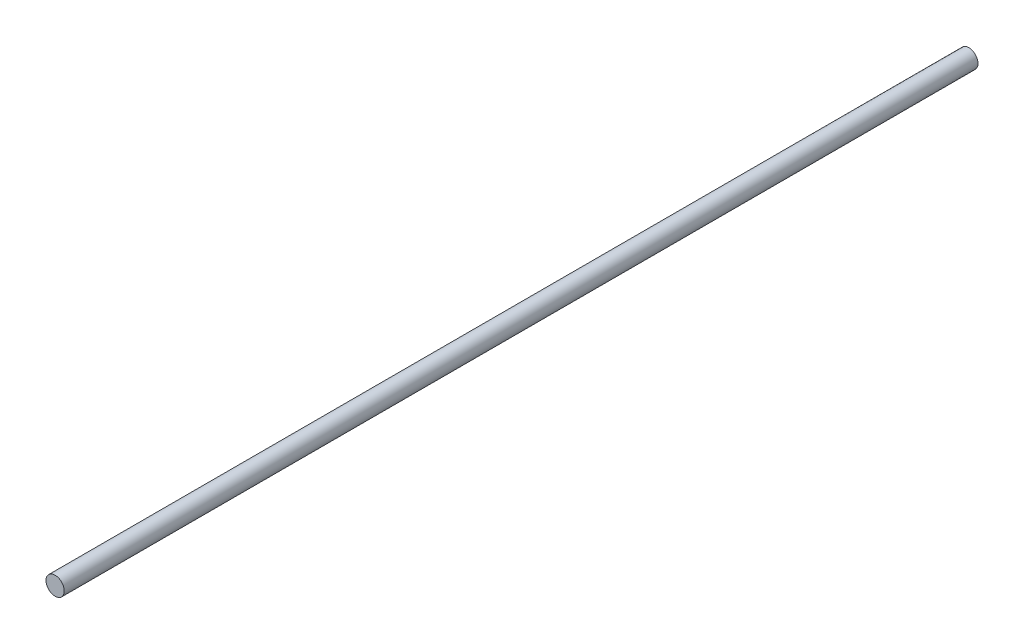
ISO-10303-21;
HEADER;
FILE_DESCRIPTION(('STEP AP214'),'2;1');
FILE_NAME('part.step','',(''),(''),'','','');
FILE_SCHEMA(('AUTOMOTIVE_DESIGN { 1 0 10303 214 1 1 1 1 }'));
ENDSEC;
DATA;
#1=APPLICATION_CONTEXT('core data for automotive mechanical design processes');
#2=APPLICATION_PROTOCOL_DEFINITION('international standard','automotive_design',2000,#1);
#3=PRODUCT_CONTEXT('',#1,'mechanical');
#4=PRODUCT('Part','Part','',(#3));
#5=PRODUCT_RELATED_PRODUCT_CATEGORY('part','',(#4));
#6=PRODUCT_DEFINITION_FORMATION('','',#4);
#7=PRODUCT_DEFINITION_CONTEXT('part definition',#1,'design');
#8=PRODUCT_DEFINITION('design','',#6,#7);
#9=PRODUCT_DEFINITION_SHAPE('','',#8);
#10=(LENGTH_UNIT() NAMED_UNIT(*) SI_UNIT(.MILLI.,.METRE.));
#11=(NAMED_UNIT(*) PLANE_ANGLE_UNIT() SI_UNIT($,.RADIAN.));
#12=(NAMED_UNIT(*) SI_UNIT($,.STERADIAN.) SOLID_ANGLE_UNIT());
#13=UNCERTAINTY_MEASURE_WITH_UNIT(LENGTH_MEASURE(1.E-05),#10,'distance_accuracy_value','');
#14=(GEOMETRIC_REPRESENTATION_CONTEXT(3) GLOBAL_UNCERTAINTY_ASSIGNED_CONTEXT((#13)) GLOBAL_UNIT_ASSIGNED_CONTEXT((#10,
#11,#12)) REPRESENTATION_CONTEXT('',''));
#15=CARTESIAN_POINT('',(0.,0.,0.));
#16=DIRECTION('',(0.,0.,1.));
#17=DIRECTION('',(1.,0.,0.));
#18=AXIS2_PLACEMENT_3D('',#15,#16,#17);
#19=CARTESIAN_POINT('',(0.,0.,50.));
#20=DIRECTION('',(0.,0.,-1.));
#21=DIRECTION('',(-1.,0.,0.));
#22=AXIS2_PLACEMENT_3D('',#19,#20,#21);
#23=CYLINDRICAL_SURFACE('',#22,1.);
#24=CARTESIAN_POINT('',(0.,0.,50.));
#25=DIRECTION('',(0.,0.,1.));
#26=DIRECTION('',(1.,0.,0.));
#27=AXIS2_PLACEMENT_3D('',#24,#25,#26);
#28=CIRCLE('',#27,1.);
#29=CARTESIAN_POINT('',(1.,0.,50.));
#30=VERTEX_POINT('',#29);
#31=EDGE_CURVE('E10',#30,#30,#28,.T.);
#32=ORIENTED_EDGE('',*,*,#31,.F.);
#33=EDGE_LOOP('',(#32));
#34=FACE_BOUND('',#33,.T.);
#35=CARTESIAN_POINT('',(0.,0.,-50.));
#36=DIRECTION('',(0.,0.,1.));
#37=DIRECTION('',(1.,0.,0.));
#38=AXIS2_PLACEMENT_3D('',#35,#36,#37);
#39=CIRCLE('',#38,1.);
#40=CARTESIAN_POINT('',(1.,0.,-50.));
#41=VERTEX_POINT('',#40);
#42=EDGE_CURVE('E45',#41,#41,#39,.T.);
#43=ORIENTED_EDGE('',*,*,#42,.T.);
#44=EDGE_LOOP('',(#43));
#45=FACE_BOUND('',#44,.T.);
#46=ADVANCED_FACE('F39',(#34,#45),#23,.T.);
#47=CARTESIAN_POINT('',(0.,0.,50.));
#48=DIRECTION('',(0.,0.,1.));
#49=DIRECTION('',(1.,0.,0.));
#50=AXIS2_PLACEMENT_3D('',#47,#48,#49);
#51=PLANE('',#50);
#52=ORIENTED_EDGE('',*,*,#31,.T.);
#53=EDGE_LOOP('',(#52));
#54=FACE_BOUND('',#53,.T.);
#55=ADVANCED_FACE('F53',(#54),#51,.T.);
#56=CARTESIAN_POINT('',(0.,0.,-50.));
#57=DIRECTION('',(0.,0.,1.));
#58=DIRECTION('',(1.,0.,0.));
#59=AXIS2_PLACEMENT_3D('',#56,#57,#58);
#60=PLANE('',#59);
#61=ORIENTED_EDGE('',*,*,#42,.F.);
#62=EDGE_LOOP('',(#61));
#63=FACE_BOUND('',#62,.T.);
#64=ADVANCED_FACE('F55',(#63),#60,.F.);
#65=CLOSED_SHELL('',(#46,#55,#64));
#66=MANIFOLD_SOLID_BREP('B2',#65);
#67=ADVANCED_BREP_SHAPE_REPRESENTATION('',(#18,#66),#14);
#68=SHAPE_DEFINITION_REPRESENTATION(#9,#67);
ENDSEC;
END-ISO-10303-21;
